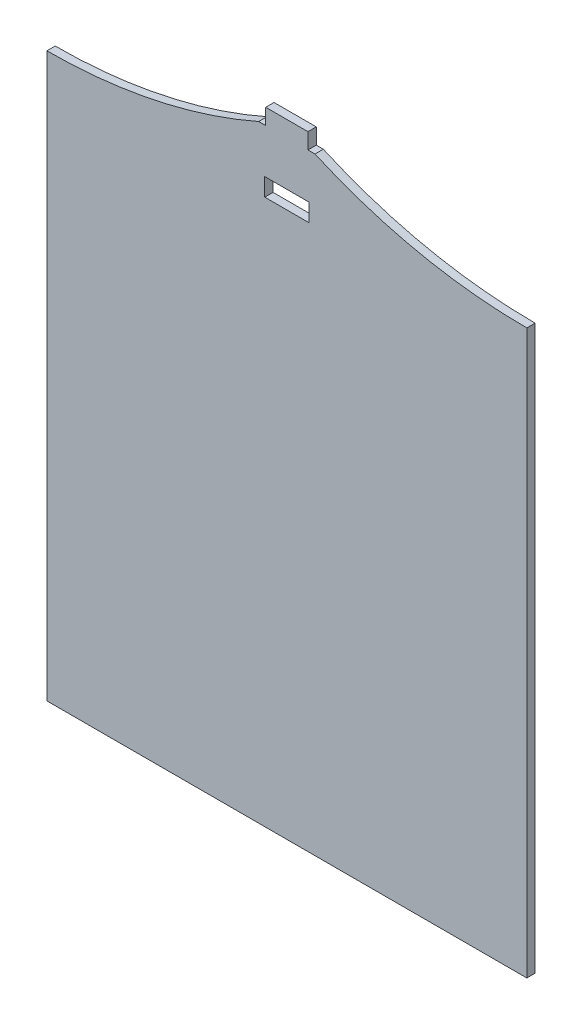
ISO-10303-21;
HEADER;
FILE_DESCRIPTION(('STEP AP214'),'2;1');
FILE_NAME('part.step','',(''),(''),'','','');
FILE_SCHEMA(('AUTOMOTIVE_DESIGN { 1 0 10303 214 1 1 1 1 }'));
ENDSEC;
DATA;
#1=APPLICATION_CONTEXT('core data for automotive mechanical design processes');
#2=APPLICATION_PROTOCOL_DEFINITION('international standard','automotive_design',2000,#1);
#3=PRODUCT_CONTEXT('',#1,'mechanical');
#4=PRODUCT('Part','Part','',(#3));
#5=PRODUCT_RELATED_PRODUCT_CATEGORY('part','',(#4));
#6=PRODUCT_DEFINITION_FORMATION('','',#4);
#7=PRODUCT_DEFINITION_CONTEXT('part definition',#1,'design');
#8=PRODUCT_DEFINITION('design','',#6,#7);
#9=PRODUCT_DEFINITION_SHAPE('','',#8);
#10=(LENGTH_UNIT() NAMED_UNIT(*) SI_UNIT(.MILLI.,.METRE.));
#11=(NAMED_UNIT(*) PLANE_ANGLE_UNIT() SI_UNIT($,.RADIAN.));
#12=(NAMED_UNIT(*) SI_UNIT($,.STERADIAN.) SOLID_ANGLE_UNIT());
#13=UNCERTAINTY_MEASURE_WITH_UNIT(LENGTH_MEASURE(1.E-05),#10,'distance_accuracy_value','');
#14=(GEOMETRIC_REPRESENTATION_CONTEXT(3) GLOBAL_UNCERTAINTY_ASSIGNED_CONTEXT((#13)) GLOBAL_UNIT_ASSIGNED_CONTEXT((#10,
#11,#12)) REPRESENTATION_CONTEXT('',''));
#15=CARTESIAN_POINT('',(0.,0.,0.));
#16=DIRECTION('',(0.,0.,1.));
#17=DIRECTION('',(1.,0.,0.));
#18=AXIS2_PLACEMENT_3D('',#15,#16,#17);
#19=CARTESIAN_POINT('',(-131.668907265746,273.641202928556,2.95));
#20=DIRECTION('',(0.,0.,1.));
#21=DIRECTION('',(1.,0.,0.));
#22=AXIS2_PLACEMENT_3D('',#19,#20,#21);
#23=PLANE('',#22);
#24=CARTESIAN_POINT('',(-131.668907265746,273.641202928556,2.95));
#25=DIRECTION('',(0.,0.,-1.));
#26=DIRECTION('',(1.,0.,0.));
#27=AXIS2_PLACEMENT_3D('',#24,#25,#26);
#28=CIRCLE('',#27,186.339615626969);
#29=CARTESIAN_POINT('',(-56.4189072657465,103.171587301587,2.95));
#30=VERTEX_POINT('',#29);
#31=CARTESIAN_POINT('',(-131.668907265746,87.3015873015873,2.95));
#32=VERTEX_POINT('',#31);
#33=EDGE_CURVE('E170',#30,#32,#28,.T.);
#34=ORIENTED_EDGE('',*,*,#33,.T.);
#35=DIRECTION('',(0.,-1.,0.));
#36=VECTOR('',#35,1.);
#37=CARTESIAN_POINT('',(-131.668907265746,87.3015873015873,2.95));
#38=LINE('',#37,#36);
#39=CARTESIAN_POINT('',(-131.668907265746,-112.698412698413,2.95));
#40=VERTEX_POINT('',#39);
#41=EDGE_CURVE('E173',#32,#40,#38,.T.);
#42=ORIENTED_EDGE('',*,*,#41,.T.);
#43=DIRECTION('',(1.,0.,0.));
#44=VECTOR('',#43,1.);
#45=CARTESIAN_POINT('',(-131.668907265746,-112.698412698413,2.95));
#46=LINE('',#45,#44);
#47=CARTESIAN_POINT('',(38.8310927342536,-112.698412698413,2.95));
#48=VERTEX_POINT('',#47);
#49=EDGE_CURVE('E176',#40,#48,#46,.T.);
#50=ORIENTED_EDGE('',*,*,#49,.T.);
#51=DIRECTION('',(0.,1.,0.));
#52=VECTOR('',#51,1.);
#53=CARTESIAN_POINT('',(38.8310927342535,87.3015873015873,2.95));
#54=LINE('',#53,#52);
#55=CARTESIAN_POINT('',(38.8310927342535,87.3015873015873,2.95));
#56=VERTEX_POINT('',#55);
#57=EDGE_CURVE('E178',#48,#56,#54,.T.);
#58=ORIENTED_EDGE('',*,*,#57,.T.);
#59=CARTESIAN_POINT('',(38.8310927342535,273.641202928556,2.95));
#60=DIRECTION('',(0.,0.,-1.));
#61=DIRECTION('',(1.,0.,0.));
#62=AXIS2_PLACEMENT_3D('',#59,#60,#61);
#63=CIRCLE('',#62,186.339615626969);
#64=CARTESIAN_POINT('',(-36.4189072657465,103.171587301587,2.95));
#65=VERTEX_POINT('',#64);
#66=EDGE_CURVE('E180',#56,#65,#63,.T.);
#67=ORIENTED_EDGE('',*,*,#66,.T.);
#68=DIRECTION('',(-1.,0.,0.));
#69=VECTOR('',#68,1.);
#70=CARTESIAN_POINT('',(-38.9189072657465,103.171587301587,2.95));
#71=LINE('',#70,#69);
#72=CARTESIAN_POINT('',(-38.9189072657465,103.171587301587,2.95));
#73=VERTEX_POINT('',#72);
#74=EDGE_CURVE('E182',#65,#73,#71,.T.);
#75=ORIENTED_EDGE('',*,*,#74,.T.);
#76=DIRECTION('',(0.,1.,0.));
#77=VECTOR('',#76,1.);
#78=CARTESIAN_POINT('',(-38.9189072657465,103.171587301587,2.95));
#79=LINE('',#78,#77);
#80=CARTESIAN_POINT('',(-38.9189072657465,108.801587301587,2.95));
#81=VERTEX_POINT('',#80);
#82=EDGE_CURVE('E184',#73,#81,#79,.T.);
#83=ORIENTED_EDGE('',*,*,#82,.T.);
#84=DIRECTION('',(-1.,0.,0.));
#85=VECTOR('',#84,1.);
#86=CARTESIAN_POINT('',(-53.9189072657465,108.801587301587,2.95));
#87=LINE('',#86,#85);
#88=CARTESIAN_POINT('',(-53.9189072657465,108.801587301587,2.95));
#89=VERTEX_POINT('',#88);
#90=EDGE_CURVE('E186',#81,#89,#87,.T.);
#91=ORIENTED_EDGE('',*,*,#90,.T.);
#92=DIRECTION('',(0.,-1.,0.));
#93=VECTOR('',#92,1.);
#94=CARTESIAN_POINT('',(-53.9189072657465,103.171587301587,2.95));
#95=LINE('',#94,#93);
#96=CARTESIAN_POINT('',(-53.9189072657465,103.171587301587,2.95));
#97=VERTEX_POINT('',#96);
#98=EDGE_CURVE('E188',#89,#97,#95,.T.);
#99=ORIENTED_EDGE('',*,*,#98,.T.);
#100=DIRECTION('',(-1.,0.,0.));
#101=VECTOR('',#100,1.);
#102=CARTESIAN_POINT('',(-56.4189072657465,103.171587301587,2.95));
#103=LINE('',#102,#101);
#104=EDGE_CURVE('E190',#97,#30,#103,.T.);
#105=ORIENTED_EDGE('',*,*,#104,.T.);
#106=EDGE_LOOP('',(#34,#42,#50,#58,#67,#75,#83,#91,#99,#105));
#107=FACE_BOUND('',#106,.T.);
#108=DIRECTION('',(1.,0.,0.));
#109=VECTOR('',#108,1.);
#110=CARTESIAN_POINT('',(-54.2689072657465,80.9715873015873,2.95));
#111=LINE('',#110,#109);
#112=CARTESIAN_POINT('',(-54.2689072657465,80.9715873015873,2.95));
#113=VERTEX_POINT('',#112);
#114=CARTESIAN_POINT('',(-38.5689072657465,80.9715873015873,2.95));
#115=VERTEX_POINT('',#114);
#116=EDGE_CURVE('E142',#113,#115,#111,.T.);
#117=ORIENTED_EDGE('',*,*,#116,.F.);
#118=DIRECTION('',(0.,-1.,0.));
#119=VECTOR('',#118,1.);
#120=CARTESIAN_POINT('',(-54.2689072657465,87.3015873015873,2.95));
#121=LINE('',#120,#119);
#122=CARTESIAN_POINT('',(-54.2689072657465,87.3015873015873,2.95));
#123=VERTEX_POINT('',#122);
#124=EDGE_CURVE('E134',#123,#113,#121,.T.);
#125=ORIENTED_EDGE('',*,*,#124,.F.);
#126=DIRECTION('',(-1.,0.,0.));
#127=VECTOR('',#126,1.);
#128=CARTESIAN_POINT('',(-54.2689072657465,87.3015873015873,2.95));
#129=LINE('',#128,#127);
#130=CARTESIAN_POINT('',(-38.5689072657465,87.3015873015873,2.95));
#131=VERTEX_POINT('',#130);
#132=EDGE_CURVE('E156',#131,#123,#129,.T.);
#133=ORIENTED_EDGE('',*,*,#132,.F.);
#134=DIRECTION('',(0.,1.,0.));
#135=VECTOR('',#134,1.);
#136=CARTESIAN_POINT('',(-38.5689072657465,87.3015873015873,2.95));
#137=LINE('',#136,#135);
#138=EDGE_CURVE('E154',#115,#131,#137,.T.);
#139=ORIENTED_EDGE('',*,*,#138,.F.);
#140=EDGE_LOOP('',(#117,#125,#133,#139));
#141=FACE_BOUND('',#140,.T.);
#142=ADVANCED_FACE('F33',(#107,#141),#23,.T.);
#143=CARTESIAN_POINT('',(-131.668907265746,273.641202928556,0.));
#144=DIRECTION('',(0.,0.,1.));
#145=DIRECTION('',(1.,0.,0.));
#146=AXIS2_PLACEMENT_3D('',#143,#144,#145);
#147=PLANE('',#146);
#148=CARTESIAN_POINT('',(-131.668907265746,273.641202928556,0.));
#149=DIRECTION('',(0.,0.,-1.));
#150=DIRECTION('',(1.,0.,0.));
#151=AXIS2_PLACEMENT_3D('',#148,#149,#150);
#152=CIRCLE('',#151,186.339615626969);
#153=CARTESIAN_POINT('',(-56.4189072657465,103.171587301587,0.));
#154=VERTEX_POINT('',#153);
#155=CARTESIAN_POINT('',(-131.668907265746,87.3015873015873,0.));
#156=VERTEX_POINT('',#155);
#157=EDGE_CURVE('E150',#154,#156,#152,.T.);
#158=ORIENTED_EDGE('',*,*,#157,.F.);
#159=DIRECTION('',(-1.,0.,0.));
#160=VECTOR('',#159,1.);
#161=CARTESIAN_POINT('',(-56.4189072657465,103.171587301587,0.));
#162=LINE('',#161,#160);
#163=CARTESIAN_POINT('',(-53.9189072657465,103.171587301587,0.));
#164=VERTEX_POINT('',#163);
#165=EDGE_CURVE('E174',#164,#154,#162,.T.);
#166=ORIENTED_EDGE('',*,*,#165,.F.);
#167=DIRECTION('',(0.,-1.,0.));
#168=VECTOR('',#167,1.);
#169=CARTESIAN_POINT('',(-53.9189072657465,103.171587301587,0.));
#170=LINE('',#169,#168);
#171=CARTESIAN_POINT('',(-53.9189072657465,108.801587301587,0.));
#172=VERTEX_POINT('',#171);
#173=EDGE_CURVE('E209',#172,#164,#170,.T.);
#174=ORIENTED_EDGE('',*,*,#173,.F.);
#175=DIRECTION('',(-1.,0.,0.));
#176=VECTOR('',#175,1.);
#177=CARTESIAN_POINT('',(-53.9189072657465,108.801587301587,0.));
#178=LINE('',#177,#176);
#179=CARTESIAN_POINT('',(-38.9189072657465,108.801587301587,0.));
#180=VERTEX_POINT('',#179);
#181=EDGE_CURVE('E207',#180,#172,#178,.T.);
#182=ORIENTED_EDGE('',*,*,#181,.F.);
#183=DIRECTION('',(0.,1.,0.));
#184=VECTOR('',#183,1.);
#185=CARTESIAN_POINT('',(-38.9189072657465,103.171587301587,0.));
#186=LINE('',#185,#184);
#187=CARTESIAN_POINT('',(-38.9189072657465,103.171587301587,0.));
#188=VERTEX_POINT('',#187);
#189=EDGE_CURVE('E205',#188,#180,#186,.T.);
#190=ORIENTED_EDGE('',*,*,#189,.F.);
#191=DIRECTION('',(-1.,0.,0.));
#192=VECTOR('',#191,1.);
#193=CARTESIAN_POINT('',(-38.9189072657465,103.171587301587,0.));
#194=LINE('',#193,#192);
#195=CARTESIAN_POINT('',(-36.4189072657465,103.171587301587,0.));
#196=VERTEX_POINT('',#195);
#197=EDGE_CURVE('E203',#196,#188,#194,.T.);
#198=ORIENTED_EDGE('',*,*,#197,.F.);
#199=CARTESIAN_POINT('',(38.8310927342535,273.641202928556,0.));
#200=DIRECTION('',(0.,0.,-1.));
#201=DIRECTION('',(1.,0.,0.));
#202=AXIS2_PLACEMENT_3D('',#199,#200,#201);
#203=CIRCLE('',#202,186.339615626969);
#204=CARTESIAN_POINT('',(38.8310927342535,87.3015873015873,0.));
#205=VERTEX_POINT('',#204);
#206=EDGE_CURVE('E201',#205,#196,#203,.T.);
#207=ORIENTED_EDGE('',*,*,#206,.F.);
#208=DIRECTION('',(0.,1.,0.));
#209=VECTOR('',#208,1.);
#210=CARTESIAN_POINT('',(38.8310927342535,87.3015873015873,0.));
#211=LINE('',#210,#209);
#212=CARTESIAN_POINT('',(38.8310927342536,-112.698412698413,0.));
#213=VERTEX_POINT('',#212);
#214=EDGE_CURVE('E199',#213,#205,#211,.T.);
#215=ORIENTED_EDGE('',*,*,#214,.F.);
#216=DIRECTION('',(1.,0.,0.));
#217=VECTOR('',#216,1.);
#218=CARTESIAN_POINT('',(-131.668907265746,-112.698412698413,0.));
#219=LINE('',#218,#217);
#220=CARTESIAN_POINT('',(-131.668907265746,-112.698412698413,0.));
#221=VERTEX_POINT('',#220);
#222=EDGE_CURVE('E197',#221,#213,#219,.T.);
#223=ORIENTED_EDGE('',*,*,#222,.F.);
#224=DIRECTION('',(0.,-1.,0.));
#225=VECTOR('',#224,1.);
#226=CARTESIAN_POINT('',(-131.668907265746,87.3015873015873,0.));
#227=LINE('',#226,#225);
#228=EDGE_CURVE('E195',#156,#221,#227,.T.);
#229=ORIENTED_EDGE('',*,*,#228,.F.);
#230=EDGE_LOOP('',(#158,#166,#174,#182,#190,#198,#207,#215,#223,#229));
#231=FACE_BOUND('',#230,.T.);
#232=DIRECTION('',(0.,-1.,0.));
#233=VECTOR('',#232,1.);
#234=CARTESIAN_POINT('',(-54.2689072657465,87.3015873015873,0.));
#235=LINE('',#234,#233);
#236=CARTESIAN_POINT('',(-54.2689072657465,87.3015873015873,0.));
#237=VERTEX_POINT('',#236);
#238=CARTESIAN_POINT('',(-54.2689072657465,80.9715873015873,0.));
#239=VERTEX_POINT('',#238);
#240=EDGE_CURVE('E56',#237,#239,#235,.T.);
#241=ORIENTED_EDGE('',*,*,#240,.T.);
#242=DIRECTION('',(1.,0.,0.));
#243=VECTOR('',#242,1.);
#244=CARTESIAN_POINT('',(-54.2689072657465,80.9715873015873,0.));
#245=LINE('',#244,#243);
#246=CARTESIAN_POINT('',(-38.5689072657465,80.9715873015873,0.));
#247=VERTEX_POINT('',#246);
#248=EDGE_CURVE('E149',#239,#247,#245,.T.);
#249=ORIENTED_EDGE('',*,*,#248,.T.);
#250=DIRECTION('',(0.,1.,0.));
#251=VECTOR('',#250,1.);
#252=CARTESIAN_POINT('',(-38.5689072657465,87.3015873015873,0.));
#253=LINE('',#252,#251);
#254=CARTESIAN_POINT('',(-38.5689072657465,87.3015873015873,0.));
#255=VERTEX_POINT('',#254);
#256=EDGE_CURVE('E162',#247,#255,#253,.T.);
#257=ORIENTED_EDGE('',*,*,#256,.T.);
#258=DIRECTION('',(-1.,0.,0.));
#259=VECTOR('',#258,1.);
#260=CARTESIAN_POINT('',(-54.2689072657465,87.3015873015873,0.));
#261=LINE('',#260,#259);
#262=EDGE_CURVE('E143',#255,#237,#261,.T.);
#263=ORIENTED_EDGE('',*,*,#262,.T.);
#264=EDGE_LOOP('',(#241,#249,#257,#263));
#265=FACE_BOUND('',#264,.T.);
#266=ADVANCED_FACE('F245',(#231,#265),#147,.F.);
#267=CARTESIAN_POINT('',(-131.668907265746,273.641202928556,2.95));
#268=DIRECTION('',(0.,0.,-1.));
#269=DIRECTION('',(-1.,0.,0.));
#270=AXIS2_PLACEMENT_3D('',#267,#268,#269);
#271=CYLINDRICAL_SURFACE('',#270,186.339615626969);
#272=ORIENTED_EDGE('',*,*,#157,.T.);
#273=DIRECTION('',(0.,0.,-1.));
#274=VECTOR('',#273,1.);
#275=CARTESIAN_POINT('',(-131.668907265746,87.3015873015873,2.95));
#276=LINE('',#275,#274);
#277=EDGE_CURVE('E11',#32,#156,#276,.T.);
#278=ORIENTED_EDGE('',*,*,#277,.F.);
#279=ORIENTED_EDGE('',*,*,#33,.F.);
#280=DIRECTION('',(0.,0.,-1.));
#281=VECTOR('',#280,1.);
#282=CARTESIAN_POINT('',(-56.4189072657465,103.171587301587,2.95));
#283=LINE('',#282,#281);
#284=EDGE_CURVE('E192',#30,#154,#283,.T.);
#285=ORIENTED_EDGE('',*,*,#284,.T.);
#286=EDGE_LOOP('',(#272,#278,#279,#285));
#287=FACE_BOUND('',#286,.T.);
#288=ADVANCED_FACE('F35',(#287),#271,.F.);
#289=CARTESIAN_POINT('',(-131.668907265746,87.3015873015873,2.95));
#290=DIRECTION('',(1.,0.,0.));
#291=DIRECTION('',(0.,1.,0.));
#292=AXIS2_PLACEMENT_3D('',#289,#290,#291);
#293=PLANE('',#292);
#294=ORIENTED_EDGE('',*,*,#228,.T.);
#295=DIRECTION('',(0.,0.,-1.));
#296=VECTOR('',#295,1.);
#297=CARTESIAN_POINT('',(-131.668907265746,-112.698412698413,2.95));
#298=LINE('',#297,#296);
#299=EDGE_CURVE('E41',#40,#221,#298,.T.);
#300=ORIENTED_EDGE('',*,*,#299,.F.);
#301=ORIENTED_EDGE('',*,*,#41,.F.);
#302=ORIENTED_EDGE('',*,*,#277,.T.);
#303=EDGE_LOOP('',(#294,#300,#301,#302));
#304=FACE_BOUND('',#303,.T.);
#305=ADVANCED_FACE('F262',(#304),#293,.F.);
#306=CARTESIAN_POINT('',(-131.668907265746,-112.698412698413,2.95));
#307=DIRECTION('',(0.,1.,0.));
#308=DIRECTION('',(0.,0.,1.));
#309=AXIS2_PLACEMENT_3D('',#306,#307,#308);
#310=PLANE('',#309);
#311=ORIENTED_EDGE('',*,*,#222,.T.);
#312=DIRECTION('',(0.,0.,-1.));
#313=VECTOR('',#312,1.);
#314=CARTESIAN_POINT('',(38.8310927342536,-112.698412698413,2.95));
#315=LINE('',#314,#313);
#316=EDGE_CURVE('E232',#48,#213,#315,.T.);
#317=ORIENTED_EDGE('',*,*,#316,.F.);
#318=ORIENTED_EDGE('',*,*,#49,.F.);
#319=ORIENTED_EDGE('',*,*,#299,.T.);
#320=EDGE_LOOP('',(#311,#317,#318,#319));
#321=FACE_BOUND('',#320,.T.);
#322=ADVANCED_FACE('F239',(#321),#310,.F.);
#323=CARTESIAN_POINT('',(38.8310927342535,87.3015873015873,2.95));
#324=DIRECTION('',(-1.,0.,0.));
#325=DIRECTION('',(0.,-1.,0.));
#326=AXIS2_PLACEMENT_3D('',#323,#324,#325);
#327=PLANE('',#326);
#328=ORIENTED_EDGE('',*,*,#214,.T.);
#329=DIRECTION('',(0.,0.,-1.));
#330=VECTOR('',#329,1.);
#331=CARTESIAN_POINT('',(38.8310927342535,87.3015873015873,2.95));
#332=LINE('',#331,#330);
#333=EDGE_CURVE('E229',#56,#205,#332,.T.);
#334=ORIENTED_EDGE('',*,*,#333,.F.);
#335=ORIENTED_EDGE('',*,*,#57,.F.);
#336=ORIENTED_EDGE('',*,*,#316,.T.);
#337=EDGE_LOOP('',(#328,#334,#335,#336));
#338=FACE_BOUND('',#337,.T.);
#339=ADVANCED_FACE('F251',(#338),#327,.F.);
#340=CARTESIAN_POINT('',(38.8310927342535,273.641202928556,2.95));
#341=DIRECTION('',(0.,0.,-1.));
#342=DIRECTION('',(-1.,0.,0.));
#343=AXIS2_PLACEMENT_3D('',#340,#341,#342);
#344=CYLINDRICAL_SURFACE('',#343,186.339615626969);
#345=ORIENTED_EDGE('',*,*,#206,.T.);
#346=DIRECTION('',(0.,0.,-1.));
#347=VECTOR('',#346,1.);
#348=CARTESIAN_POINT('',(-36.4189072657465,103.171587301587,2.95));
#349=LINE('',#348,#347);
#350=EDGE_CURVE('E226',#65,#196,#349,.T.);
#351=ORIENTED_EDGE('',*,*,#350,.F.);
#352=ORIENTED_EDGE('',*,*,#66,.F.);
#353=ORIENTED_EDGE('',*,*,#333,.T.);
#354=EDGE_LOOP('',(#345,#351,#352,#353));
#355=FACE_BOUND('',#354,.T.);
#356=ADVANCED_FACE('F255',(#355),#344,.F.);
#357=CARTESIAN_POINT('',(-38.9189072657465,103.171587301587,2.95));
#358=DIRECTION('',(0.,-1.,0.));
#359=DIRECTION('',(0.,0.,-1.));
#360=AXIS2_PLACEMENT_3D('',#357,#358,#359);
#361=PLANE('',#360);
#362=ORIENTED_EDGE('',*,*,#197,.T.);
#363=DIRECTION('',(0.,0.,-1.));
#364=VECTOR('',#363,1.);
#365=CARTESIAN_POINT('',(-38.9189072657465,103.171587301587,2.95));
#366=LINE('',#365,#364);
#367=EDGE_CURVE('E223',#73,#188,#366,.T.);
#368=ORIENTED_EDGE('',*,*,#367,.F.);
#369=ORIENTED_EDGE('',*,*,#74,.F.);
#370=ORIENTED_EDGE('',*,*,#350,.T.);
#371=EDGE_LOOP('',(#362,#368,#369,#370));
#372=FACE_BOUND('',#371,.T.);
#373=ADVANCED_FACE('F285',(#372),#361,.F.);
#374=CARTESIAN_POINT('',(-38.9189072657465,103.171587301587,2.95));
#375=DIRECTION('',(-1.,0.,0.));
#376=DIRECTION('',(0.,0.,1.));
#377=AXIS2_PLACEMENT_3D('',#374,#375,#376);
#378=PLANE('',#377);
#379=ORIENTED_EDGE('',*,*,#189,.T.);
#380=DIRECTION('',(0.,0.,-1.));
#381=VECTOR('',#380,1.);
#382=CARTESIAN_POINT('',(-38.9189072657465,108.801587301587,2.95));
#383=LINE('',#382,#381);
#384=EDGE_CURVE('E220',#81,#180,#383,.T.);
#385=ORIENTED_EDGE('',*,*,#384,.F.);
#386=ORIENTED_EDGE('',*,*,#82,.F.);
#387=ORIENTED_EDGE('',*,*,#367,.T.);
#388=EDGE_LOOP('',(#379,#385,#386,#387));
#389=FACE_BOUND('',#388,.T.);
#390=ADVANCED_FACE('F282',(#389),#378,.F.);
#391=CARTESIAN_POINT('',(-53.9189072657465,108.801587301587,2.95));
#392=DIRECTION('',(0.,-1.,0.));
#393=DIRECTION('',(0.,0.,-1.));
#394=AXIS2_PLACEMENT_3D('',#391,#392,#393);
#395=PLANE('',#394);
#396=ORIENTED_EDGE('',*,*,#181,.T.);
#397=DIRECTION('',(0.,0.,-1.));
#398=VECTOR('',#397,1.);
#399=CARTESIAN_POINT('',(-53.9189072657465,108.801587301587,2.95));
#400=LINE('',#399,#398);
#401=EDGE_CURVE('E217',#89,#172,#400,.T.);
#402=ORIENTED_EDGE('',*,*,#401,.F.);
#403=ORIENTED_EDGE('',*,*,#90,.F.);
#404=ORIENTED_EDGE('',*,*,#384,.T.);
#405=EDGE_LOOP('',(#396,#402,#403,#404));
#406=FACE_BOUND('',#405,.T.);
#407=ADVANCED_FACE('F278',(#406),#395,.F.);
#408=CARTESIAN_POINT('',(-53.9189072657465,103.171587301587,2.95));
#409=DIRECTION('',(1.,0.,0.));
#410=DIRECTION('',(0.,0.,-1.));
#411=AXIS2_PLACEMENT_3D('',#408,#409,#410);
#412=PLANE('',#411);
#413=ORIENTED_EDGE('',*,*,#173,.T.);
#414=DIRECTION('',(0.,0.,-1.));
#415=VECTOR('',#414,1.);
#416=CARTESIAN_POINT('',(-53.9189072657465,103.171587301587,2.95));
#417=LINE('',#416,#415);
#418=EDGE_CURVE('E214',#97,#164,#417,.T.);
#419=ORIENTED_EDGE('',*,*,#418,.F.);
#420=ORIENTED_EDGE('',*,*,#98,.F.);
#421=ORIENTED_EDGE('',*,*,#401,.T.);
#422=EDGE_LOOP('',(#413,#419,#420,#421));
#423=FACE_BOUND('',#422,.T.);
#424=ADVANCED_FACE('F274',(#423),#412,.F.);
#425=CARTESIAN_POINT('',(-56.4189072657465,103.171587301587,2.95));
#426=DIRECTION('',(0.,-1.,0.));
#427=DIRECTION('',(0.,0.,-1.));
#428=AXIS2_PLACEMENT_3D('',#425,#426,#427);
#429=PLANE('',#428);
#430=ORIENTED_EDGE('',*,*,#165,.T.);
#431=ORIENTED_EDGE('',*,*,#284,.F.);
#432=ORIENTED_EDGE('',*,*,#104,.F.);
#433=ORIENTED_EDGE('',*,*,#418,.T.);
#434=EDGE_LOOP('',(#430,#431,#432,#433));
#435=FACE_BOUND('',#434,.T.);
#436=ADVANCED_FACE('F269',(#435),#429,.F.);
#437=CARTESIAN_POINT('',(-54.2689072657465,87.3015873015873,2.95));
#438=DIRECTION('',(1.,0.,0.));
#439=DIRECTION('',(0.,1.,0.));
#440=AXIS2_PLACEMENT_3D('',#437,#438,#439);
#441=PLANE('',#440);
#442=ORIENTED_EDGE('',*,*,#240,.F.);
#443=DIRECTION('',(0.,0.,-1.));
#444=VECTOR('',#443,1.);
#445=CARTESIAN_POINT('',(-54.2689072657465,87.3015873015873,2.95));
#446=LINE('',#445,#444);
#447=EDGE_CURVE('E138',#123,#237,#446,.T.);
#448=ORIENTED_EDGE('',*,*,#447,.F.);
#449=ORIENTED_EDGE('',*,*,#124,.T.);
#450=DIRECTION('',(0.,0.,-1.));
#451=VECTOR('',#450,1.);
#452=CARTESIAN_POINT('',(-54.2689072657465,80.9715873015873,2.95));
#453=LINE('',#452,#451);
#454=EDGE_CURVE('E137',#113,#239,#453,.T.);
#455=ORIENTED_EDGE('',*,*,#454,.T.);
#456=EDGE_LOOP('',(#442,#448,#449,#455));
#457=FACE_BOUND('',#456,.T.);
#458=ADVANCED_FACE('F136',(#457),#441,.T.);
#459=CARTESIAN_POINT('',(-54.2689072657465,80.9715873015873,2.95));
#460=DIRECTION('',(0.,1.,0.));
#461=DIRECTION('',(0.,0.,1.));
#462=AXIS2_PLACEMENT_3D('',#459,#460,#461);
#463=PLANE('',#462);
#464=ORIENTED_EDGE('',*,*,#248,.F.);
#465=ORIENTED_EDGE('',*,*,#454,.F.);
#466=ORIENTED_EDGE('',*,*,#116,.T.);
#467=DIRECTION('',(0.,0.,-1.));
#468=VECTOR('',#467,1.);
#469=CARTESIAN_POINT('',(-38.5689072657465,80.9715873015873,2.95));
#470=LINE('',#469,#468);
#471=EDGE_CURVE('E151',#115,#247,#470,.T.);
#472=ORIENTED_EDGE('',*,*,#471,.T.);
#473=EDGE_LOOP('',(#464,#465,#466,#472));
#474=FACE_BOUND('',#473,.T.);
#475=ADVANCED_FACE('F146',(#474),#463,.T.);
#476=CARTESIAN_POINT('',(-38.5689072657465,87.3015873015873,2.95));
#477=DIRECTION('',(-1.,0.,0.));
#478=DIRECTION('',(0.,-1.,0.));
#479=AXIS2_PLACEMENT_3D('',#476,#477,#478);
#480=PLANE('',#479);
#481=ORIENTED_EDGE('',*,*,#256,.F.);
#482=ORIENTED_EDGE('',*,*,#471,.F.);
#483=ORIENTED_EDGE('',*,*,#138,.T.);
#484=DIRECTION('',(0.,0.,-1.));
#485=VECTOR('',#484,1.);
#486=CARTESIAN_POINT('',(-38.5689072657465,87.3015873015873,2.95));
#487=LINE('',#486,#485);
#488=EDGE_CURVE('E48',#131,#255,#487,.T.);
#489=ORIENTED_EDGE('',*,*,#488,.T.);
#490=EDGE_LOOP('',(#481,#482,#483,#489));
#491=FACE_BOUND('',#490,.T.);
#492=ADVANCED_FACE('F331',(#491),#480,.T.);
#493=CARTESIAN_POINT('',(-54.2689072657465,87.3015873015873,2.95));
#494=DIRECTION('',(0.,-1.,0.));
#495=DIRECTION('',(0.,0.,-1.));
#496=AXIS2_PLACEMENT_3D('',#493,#494,#495);
#497=PLANE('',#496);
#498=ORIENTED_EDGE('',*,*,#262,.F.);
#499=ORIENTED_EDGE('',*,*,#488,.F.);
#500=ORIENTED_EDGE('',*,*,#132,.T.);
#501=ORIENTED_EDGE('',*,*,#447,.T.);
#502=EDGE_LOOP('',(#498,#499,#500,#501));
#503=FACE_BOUND('',#502,.T.);
#504=ADVANCED_FACE('F337',(#503),#497,.T.);
#505=CLOSED_SHELL('',(#142,#266,#288,#305,#322,#339,#356,#373,#390,#407,#424,#436,#458,#475,
#492,#504));
#506=MANIFOLD_SOLID_BREP('B2',#505);
#507=ADVANCED_BREP_SHAPE_REPRESENTATION('',(#18,#506),#14);
#508=SHAPE_DEFINITION_REPRESENTATION(#9,#507);
ENDSEC;
END-ISO-10303-21;
